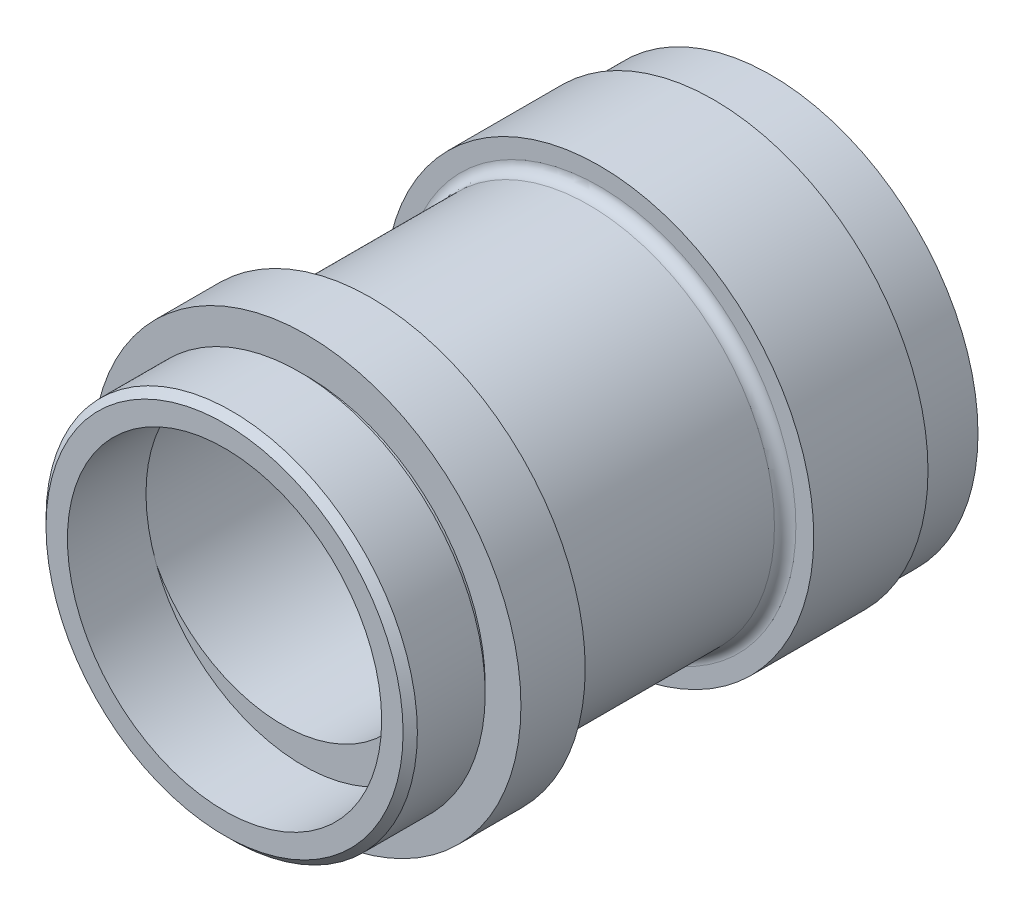
ISO-10303-21;
HEADER;
FILE_DESCRIPTION(('STEP AP214'),'2;1');
FILE_NAME('part.step','',(''),(''),'','','');
FILE_SCHEMA(('AUTOMOTIVE_DESIGN { 1 0 10303 214 1 1 1 1 }'));
ENDSEC;
DATA;
#1=APPLICATION_CONTEXT('core data for automotive mechanical design processes');
#2=APPLICATION_PROTOCOL_DEFINITION('international standard','automotive_design',2000,#1);
#3=PRODUCT_CONTEXT('',#1,'mechanical');
#4=PRODUCT('Part','Part','',(#3));
#5=PRODUCT_RELATED_PRODUCT_CATEGORY('part','',(#4));
#6=PRODUCT_DEFINITION_FORMATION('','',#4);
#7=PRODUCT_DEFINITION_CONTEXT('part definition',#1,'design');
#8=PRODUCT_DEFINITION('design','',#6,#7);
#9=PRODUCT_DEFINITION_SHAPE('','',#8);
#10=(LENGTH_UNIT() NAMED_UNIT(*) SI_UNIT(.MILLI.,.METRE.));
#11=(NAMED_UNIT(*) PLANE_ANGLE_UNIT() SI_UNIT($,.RADIAN.));
#12=(NAMED_UNIT(*) SI_UNIT($,.STERADIAN.) SOLID_ANGLE_UNIT());
#13=UNCERTAINTY_MEASURE_WITH_UNIT(LENGTH_MEASURE(1.E-05),#10,'distance_accuracy_value','');
#14=(GEOMETRIC_REPRESENTATION_CONTEXT(3) GLOBAL_UNCERTAINTY_ASSIGNED_CONTEXT((#13)) GLOBAL_UNIT_ASSIGNED_CONTEXT((#10,
#11,#12)) REPRESENTATION_CONTEXT('',''));
#15=CARTESIAN_POINT('',(0.,0.,0.));
#16=DIRECTION('',(0.,0.,1.));
#17=DIRECTION('',(1.,0.,0.));
#18=AXIS2_PLACEMENT_3D('',#15,#16,#17);
#19=CARTESIAN_POINT('',(0.,0.,4.));
#20=DIRECTION('',(0.,0.,-1.));
#21=DIRECTION('',(-1.,0.,0.));
#22=AXIS2_PLACEMENT_3D('',#19,#20,#21);
#23=CYLINDRICAL_SURFACE('',#22,14.5);
#24=CARTESIAN_POINT('',(0.,0.,4.));
#25=DIRECTION('',(0.,0.,1.));
#26=DIRECTION('',(1.,0.,0.));
#27=AXIS2_PLACEMENT_3D('',#24,#25,#26);
#28=CIRCLE('',#27,14.5);
#29=CARTESIAN_POINT('',(14.5,0.,4.));
#30=VERTEX_POINT('',#29);
#31=EDGE_CURVE('E107',#30,#30,#28,.T.);
#32=ORIENTED_EDGE('',*,*,#31,.F.);
#33=EDGE_LOOP('',(#32));
#34=FACE_BOUND('',#33,.T.);
#35=CARTESIAN_POINT('',(0.,0.,0.));
#36=DIRECTION('',(0.,0.,1.));
#37=DIRECTION('',(1.,0.,0.));
#38=AXIS2_PLACEMENT_3D('',#35,#36,#37);
#39=CIRCLE('',#38,14.5);
#40=CARTESIAN_POINT('',(14.5,0.,0.));
#41=VERTEX_POINT('',#40);
#42=EDGE_CURVE('E117',#41,#41,#39,.T.);
#43=ORIENTED_EDGE('',*,*,#42,.T.);
#44=EDGE_LOOP('',(#43));
#45=FACE_BOUND('',#44,.T.);
#46=ADVANCED_FACE('F49',(#34,#45),#23,.T.);
#47=CARTESIAN_POINT('',(0.,0.,0.));
#48=DIRECTION('',(0.,0.,1.));
#49=DIRECTION('',(1.,0.,0.));
#50=AXIS2_PLACEMENT_3D('',#47,#48,#49);
#51=PLANE('',#50);
#52=CARTESIAN_POINT('',(-1.44,0.75,0.));
#53=DIRECTION('',(0.,0.,1.));
#54=DIRECTION('',(1.,0.,0.));
#55=AXIS2_PLACEMENT_3D('',#52,#53,#54);
#56=CIRCLE('',#55,10.);
#57=CARTESIAN_POINT('',(8.56,0.75,0.));
#58=VERTEX_POINT('',#57);
#59=EDGE_CURVE('E84',#58,#58,#56,.T.);
#60=ORIENTED_EDGE('',*,*,#59,.T.);
#61=EDGE_LOOP('',(#60));
#62=FACE_BOUND('',#61,.T.);
#63=ORIENTED_EDGE('',*,*,#42,.F.);
#64=EDGE_LOOP('',(#63));
#65=FACE_BOUND('',#64,.T.);
#66=ADVANCED_FACE('F155',(#62,#65),#51,.F.);
#67=CARTESIAN_POINT('',(0.,0.,12.));
#68=DIRECTION('',(0.,0.,-1.));
#69=DIRECTION('',(-1.,0.,0.));
#70=AXIS2_PLACEMENT_3D('',#67,#68,#69);
#71=CYLINDRICAL_SURFACE('',#70,15.);
#72=CARTESIAN_POINT('',(0.,0.,12.));
#73=DIRECTION('',(0.,0.,1.));
#74=DIRECTION('',(1.,0.,0.));
#75=AXIS2_PLACEMENT_3D('',#72,#73,#74);
#76=CIRCLE('',#75,15.);
#77=CARTESIAN_POINT('',(15.,0.,12.));
#78=VERTEX_POINT('',#77);
#79=EDGE_CURVE('E114',#78,#78,#76,.T.);
#80=ORIENTED_EDGE('',*,*,#79,.F.);
#81=EDGE_LOOP('',(#80));
#82=FACE_BOUND('',#81,.T.);
#83=CARTESIAN_POINT('',(0.,0.,4.));
#84=DIRECTION('',(0.,0.,1.));
#85=DIRECTION('',(1.,0.,0.));
#86=AXIS2_PLACEMENT_3D('',#83,#84,#85);
#87=CIRCLE('',#86,15.);
#88=CARTESIAN_POINT('',(15.,0.,4.));
#89=VERTEX_POINT('',#88);
#90=EDGE_CURVE('E111',#89,#89,#87,.T.);
#91=ORIENTED_EDGE('',*,*,#90,.T.);
#92=EDGE_LOOP('',(#91));
#93=FACE_BOUND('',#92,.T.);
#94=ADVANCED_FACE('F162',(#82,#93),#71,.T.);
#95=CARTESIAN_POINT('',(0.,0.,12.));
#96=DIRECTION('',(0.,0.,1.));
#97=DIRECTION('',(1.,0.,0.));
#98=AXIS2_PLACEMENT_3D('',#95,#96,#97);
#99=PLANE('',#98);
#100=CARTESIAN_POINT('',(0.,0.,12.));
#101=DIRECTION('',(0.,0.,1.));
#102=DIRECTION('',(1.,0.,0.));
#103=AXIS2_PLACEMENT_3D('',#100,#101,#102);
#104=CIRCLE('',#103,13.75);
#105=CARTESIAN_POINT('',(13.75,0.,12.));
#106=VERTEX_POINT('',#105);
#107=EDGE_CURVE('E129',#106,#106,#104,.F.);
#108=ORIENTED_EDGE('',*,*,#107,.T.);
#109=EDGE_LOOP('',(#108));
#110=FACE_BOUND('',#109,.T.);
#111=ORIENTED_EDGE('',*,*,#79,.T.);
#112=EDGE_LOOP('',(#111));
#113=FACE_BOUND('',#112,.T.);
#114=ADVANCED_FACE('F210',(#110,#113),#99,.T.);
#115=CARTESIAN_POINT('',(0.,0.,4.));
#116=DIRECTION('',(0.,0.,1.));
#117=DIRECTION('',(1.,0.,0.));
#118=AXIS2_PLACEMENT_3D('',#115,#116,#117);
#119=PLANE('',#118);
#120=ORIENTED_EDGE('',*,*,#31,.T.);
#121=EDGE_LOOP('',(#120));
#122=FACE_BOUND('',#121,.T.);
#123=ORIENTED_EDGE('',*,*,#90,.F.);
#124=EDGE_LOOP('',(#123));
#125=FACE_BOUND('',#124,.T.);
#126=ADVANCED_FACE('F184',(#122,#125),#119,.F.);
#127=CARTESIAN_POINT('',(0.,0.,28.));
#128=DIRECTION('',(0.,0.,-1.));
#129=DIRECTION('',(-1.,0.,0.));
#130=AXIS2_PLACEMENT_3D('',#127,#128,#129);
#131=CYLINDRICAL_SURFACE('',#130,13.);
#132=CARTESIAN_POINT('',(0.,-13.,21.));
#133=CARTESIAN_POINT('',(0.0560814907698494,-12.9999994935529,20.9999975440825));
#134=CARTESIAN_POINT('',(0.1122015283261,-12.9996332271085,20.9952664359755));
#135=CARTESIAN_POINT('',(0.222889932281067,-12.9982073319335,20.9764621773833));
#136=CARTESIAN_POINT('',(0.277456450000707,-12.997146910426,20.9623783451217));
#137=CARTESIAN_POINT('',(0.383418608244872,-12.994452581674,20.9252773861471));
#138=CARTESIAN_POINT('',(0.434815983790358,-12.9928189915613,20.9022651987113));
#139=CARTESIAN_POINT('',(0.533005853178245,-12.9891617044986,20.847969326083));
#140=CARTESIAN_POINT('',(0.579799352410921,-12.9871380930081,20.816687452343));
#141=CARTESIAN_POINT('',(0.667568517957903,-12.9829230046582,20.7466658049635));
#142=CARTESIAN_POINT('',(0.708532705181918,-12.9807312093192,20.7079116606977));
#143=CARTESIAN_POINT('',(0.783382016525553,-12.9764294687494,20.6240757503406));
#144=CARTESIAN_POINT('',(0.817266834917226,-12.9743195270567,20.5789937111149));
#145=CARTESIAN_POINT('',(0.877033518122061,-12.9704168624999,20.4837133596551));
#146=CARTESIAN_POINT('',(0.902905435846584,-12.968624535088,20.4335087903064));
#147=CARTESIAN_POINT('',(0.945848345562935,-12.9655635081004,20.3294521888579));
#148=CARTESIAN_POINT('',(0.962919472356618,-12.9642948005044,20.2756002126396));
#149=CARTESIAN_POINT('',(0.987743279956157,-12.9624272217792,20.1658913947305));
#150=CARTESIAN_POINT('',(0.995514486774697,-12.9618270191131,20.1100387679558));
#151=CARTESIAN_POINT('',(1.00157507733568,-12.9613601552789,19.9978188832529));
#152=CARTESIAN_POINT('',(0.999864615135287,-12.9614934821925,19.9414516337011));
#153=CARTESIAN_POINT('',(0.987025750384139,-12.9624774073116,19.8299292739437));
#154=CARTESIAN_POINT('',(0.975917451791141,-12.9633264743837,19.7747718339038));
#155=CARTESIAN_POINT('',(0.944629454899662,-12.9656438018103,19.6671066925785));
#156=CARTESIAN_POINT('',(0.924449679526441,-12.9671120674258,19.6145990138107));
#157=CARTESIAN_POINT('',(0.875568942970116,-12.97050410972,19.5136596470741));
#158=CARTESIAN_POINT('',(0.846858928239396,-12.972428369926,19.4652323602694));
#159=CARTESIAN_POINT('',(0.781739221271187,-12.9765151166631,19.3738765736031));
#160=CARTESIAN_POINT('',(0.745329396516579,-12.978677607294,19.3309481684001));
#161=CARTESIAN_POINT('',(0.66573069422597,-12.9830039524831,19.25169180633));
#162=CARTESIAN_POINT('',(0.622524430401358,-12.9851677959587,19.2153813079507));
#163=CARTESIAN_POINT('',(0.53062007147499,-12.9892476500003,19.1505263575124));
#164=CARTESIAN_POINT('',(0.481921973376206,-12.991163660431,19.1219819096916));
#165=CARTESIAN_POINT('',(0.38040521301149,-12.9945322475704,19.0734705504451));
#166=CARTESIAN_POINT('',(0.327586197932004,-12.9959847845445,19.0535043744051));
#167=CARTESIAN_POINT('',(0.219331986593499,-12.9982622809101,19.0227283581117));
#168=CARTESIAN_POINT('',(0.163896836613429,-12.9990872513988,19.0119183559514));
#169=CARTESIAN_POINT('',(0.0521353319359007,-13.0000152355339,18.9997833458647));
#170=CARTESIAN_POINT('',(-0.00418838895979883,-13.0001200852723,18.9984342153689));
#171=CARTESIAN_POINT('',(-0.116261248401295,-12.9996009110167,19.0051961082285));
#172=CARTESIAN_POINT('',(-0.172010391499682,-12.9989768928024,19.01330705657));
#173=CARTESIAN_POINT('',(-0.281283080875072,-12.9970713651132,19.0387388802441));
#174=CARTESIAN_POINT('',(-0.334809235536229,-12.9957906511816,19.0560486127818));
#175=CARTESIAN_POINT('',(-0.438197238207755,-12.9927156735826,19.0993752864426));
#176=CARTESIAN_POINT('',(-0.488059036618082,-12.9909214029654,19.1253923454001));
#177=CARTESIAN_POINT('',(-0.58281294533008,-12.987016029033,19.1854560299777));
#178=CARTESIAN_POINT('',(-0.627694871276057,-12.9849042965023,19.2195186804667));
#179=CARTESIAN_POINT('',(-0.711112292590118,-12.9806035048102,19.2946834268227));
#180=CARTESIAN_POINT('',(-0.749647693943566,-12.9784144445039,19.3357856269521));
#181=CARTESIAN_POINT('',(-0.819360586100637,-12.974200318524,19.4239672078289));
#182=CARTESIAN_POINT('',(-0.850522366332239,-12.9721756089433,19.471059028099));
#183=CARTESIAN_POINT('',(-0.90449581532578,-12.9685242888167,19.5698209679124));
#184=CARTESIAN_POINT('',(-0.927307556813046,-12.9668976748036,19.6214910475761));
#185=CARTESIAN_POINT('',(-0.963906473397053,-12.9642285924288,19.7278865613879));
#186=CARTESIAN_POINT('',(-0.97770335706171,-12.9631854958217,19.7826086394922));
#187=CARTESIAN_POINT('',(-0.995912558294159,-12.9617993686693,19.8936009674173));
#188=CARTESIAN_POINT('',(-1.00032502648953,-12.9614563268874,19.9498711923743));
#189=CARTESIAN_POINT('',(-0.999638511579495,-12.9615092798327,20.0622063640792));
#190=CARTESIAN_POINT('',(-0.994564216946177,-12.9619033562753,20.1182714642693));
#191=CARTESIAN_POINT('',(-0.975099599309303,-12.9633820704167,20.2287507986101));
#192=CARTESIAN_POINT('',(-0.960709261076539,-12.9644667092444,20.283165030062));
#193=CARTESIAN_POINT('',(-0.923027087120174,-12.967203837997,20.3888002744591));
#194=CARTESIAN_POINT('',(-0.899735591367294,-12.968856306234,20.4400214092745));
#195=CARTESIAN_POINT('',(-0.844915171953842,-12.9725429181572,20.5378301715099));
#196=CARTESIAN_POINT('',(-0.813386405861939,-12.9745770545423,20.584417887538));
#197=CARTESIAN_POINT('',(-0.742893897823809,-12.9788040663569,20.6717634832005));
#198=CARTESIAN_POINT('',(-0.703911966411881,-12.9809973218178,20.7125066644019));
#199=CARTESIAN_POINT('',(-0.619650805552196,-12.9852920085213,20.786887075957));
#200=CARTESIAN_POINT('',(-0.574370049103566,-12.9873934173351,20.8205225782265));
#201=CARTESIAN_POINT('',(-0.478721573484144,-12.9912708677167,20.8797709397441));
#202=CARTESIAN_POINT('',(-0.428345598441361,-12.9930463676726,20.9053704936795));
#203=CARTESIAN_POINT('',(-0.32403189541908,-12.9960653549984,20.9477156130273));
#204=CARTESIAN_POINT('',(-0.270098369537907,-12.9973094574984,20.9644714210244));
#205=CARTESIAN_POINT('',(-0.179868830247522,-12.9988038385362,20.9843563268074));
#206=CARTESIAN_POINT('',(-0.144154148453302,-12.9992503735318,20.9902149789881));
#207=CARTESIAN_POINT('',(-0.0722983180735108,-12.9998486171984,20.9980376029879));
#208=CARTESIAN_POINT('',(-0.0361571704282497,-13.0000003265194,21.0000015833927));
#209=CARTESIAN_POINT('',(0.,-13.,21.));
#210=B_SPLINE_CURVE_WITH_KNOTS('',3,(#132,#133,#134,#135,#136,#137,#138,#139,#140,#141,#142,
#143,#144,#145,#146,#147,#148,#149,#150,#151,#152,#153,#154,#155,#156,#157,#158,#159,#160,#161,
#162,#163,#164,#165,#166,#167,#168,#169,#170,#171,#172,#173,#174,#175,#176,#177,#178,#179,#180,
#181,#182,#183,#184,#185,#186,#187,#188,#189,#190,#191,#192,#193,#194,#195,#196,#197,#198,#199,
#200,#201,#202,#203,#204,#205,#206,#207,#208,#209),.UNSPECIFIED.,.T.,.F.,(4,2,2,2,2,2,2,2,2,2,2,
2,2,2,2,2,2,2,2,2,2,2,2,2,2,2,2,2,2,2,2,2,2,2,2,2,2,2,4),(0.,0.168112465315284,
0.336417263394324,0.504629085620895,0.672804091988169,0.84130581709007,1.00981481756411,
1.1785321716854,1.34724694148352,1.51562505862667,1.68400043998792,1.85201653894623,
2.02003406546065,2.18823055785303,2.35642994521668,2.52506682664287,2.6937038000987,
2.86235522733701,3.03100367227984,3.19922195412495,3.36743890208858,3.53545254615542,
3.70346846400479,3.87182189353083,4.04017781674655,4.20888928027387,4.37759927436029,
4.54612727511614,4.71465257083871,4.88273990456443,5.05082751306812,5.21890870227688,
5.38698667653829,5.55548020584199,5.72401465382744,5.89282669420567,6.06144278967866,
6.16982943161637,6.27821583461809),.UNSPECIFIED.);
#211=CARTESIAN_POINT('',(0.,-13.,21.));
#212=VERTEX_POINT('',#211);
#213=EDGE_CURVE('E78',#212,#212,#210,.T.);
#214=ORIENTED_EDGE('',*,*,#213,.T.);
#215=EDGE_LOOP('',(#214));
#216=FACE_BOUND('',#215,.T.);
#217=CARTESIAN_POINT('',(0.,0.,12.75));
#218=DIRECTION('',(0.,0.,1.));
#219=DIRECTION('',(1.,0.,0.));
#220=AXIS2_PLACEMENT_3D('',#217,#218,#219);
#221=CIRCLE('',#220,13.);
#222=CARTESIAN_POINT('',(13.,0.,12.75));
#223=VERTEX_POINT('',#222);
#224=EDGE_CURVE('E126',#223,#223,#221,.T.);
#225=ORIENTED_EDGE('',*,*,#224,.T.);
#226=EDGE_LOOP('',(#225));
#227=FACE_BOUND('',#226,.T.);
#228=CARTESIAN_POINT('',(0.,0.,27.25));
#229=DIRECTION('',(0.,0.,1.));
#230=DIRECTION('',(1.,0.,0.));
#231=AXIS2_PLACEMENT_3D('',#228,#229,#230);
#232=CIRCLE('',#231,13.);
#233=CARTESIAN_POINT('',(13.,0.,27.25));
#234=VERTEX_POINT('',#233);
#235=EDGE_CURVE('E106',#234,#234,#232,.F.);
#236=ORIENTED_EDGE('',*,*,#235,.T.);
#237=EDGE_LOOP('',(#236));
#238=FACE_BOUND('',#237,.T.);
#239=ADVANCED_FACE('F180',(#216,#227,#238),#131,.T.);
#240=CARTESIAN_POINT('',(0.,0.,32.5));
#241=DIRECTION('',(0.,0.,-1.));
#242=DIRECTION('',(-1.,0.,0.));
#243=AXIS2_PLACEMENT_3D('',#240,#241,#242);
#244=CYLINDRICAL_SURFACE('',#243,15.);
#245=CARTESIAN_POINT('',(0.,0.,32.5));
#246=DIRECTION('',(0.,0.,1.));
#247=DIRECTION('',(1.,0.,0.));
#248=AXIS2_PLACEMENT_3D('',#245,#246,#247);
#249=CIRCLE('',#248,15.);
#250=CARTESIAN_POINT('',(15.,0.,32.5));
#251=VERTEX_POINT('',#250);
#252=EDGE_CURVE('E108',#251,#251,#249,.T.);
#253=ORIENTED_EDGE('',*,*,#252,.F.);
#254=EDGE_LOOP('',(#253));
#255=FACE_BOUND('',#254,.T.);
#256=CARTESIAN_POINT('',(0.,0.,28.));
#257=DIRECTION('',(0.,0.,1.));
#258=DIRECTION('',(1.,0.,0.));
#259=AXIS2_PLACEMENT_3D('',#256,#257,#258);
#260=CIRCLE('',#259,15.);
#261=CARTESIAN_POINT('',(15.,0.,28.));
#262=VERTEX_POINT('',#261);
#263=EDGE_CURVE('E102',#262,#262,#260,.T.);
#264=ORIENTED_EDGE('',*,*,#263,.T.);
#265=EDGE_LOOP('',(#264));
#266=FACE_BOUND('',#265,.T.);
#267=ADVANCED_FACE('F183',(#255,#266),#244,.T.);
#268=CARTESIAN_POINT('',(0.,0.,32.5));
#269=DIRECTION('',(0.,0.,1.));
#270=DIRECTION('',(1.,0.,0.));
#271=AXIS2_PLACEMENT_3D('',#268,#269,#270);
#272=PLANE('',#271);
#273=CARTESIAN_POINT('',(0.,0.,32.5));
#274=DIRECTION('',(0.,0.,1.));
#275=DIRECTION('',(1.,0.,0.));
#276=AXIS2_PLACEMENT_3D('',#273,#274,#275);
#277=CIRCLE('',#276,12.5);
#278=CARTESIAN_POINT('',(12.5,0.,32.5));
#279=VERTEX_POINT('',#278);
#280=EDGE_CURVE('E103',#279,#279,#277,.T.);
#281=ORIENTED_EDGE('',*,*,#280,.F.);
#282=EDGE_LOOP('',(#281));
#283=FACE_BOUND('',#282,.T.);
#284=ORIENTED_EDGE('',*,*,#252,.T.);
#285=EDGE_LOOP('',(#284));
#286=FACE_BOUND('',#285,.T.);
#287=ADVANCED_FACE('F194',(#283,#286),#272,.T.);
#288=CARTESIAN_POINT('',(0.,0.,28.));
#289=DIRECTION('',(0.,0.,1.));
#290=DIRECTION('',(1.,0.,0.));
#291=AXIS2_PLACEMENT_3D('',#288,#289,#290);
#292=PLANE('',#291);
#293=CARTESIAN_POINT('',(0.,0.,28.));
#294=DIRECTION('',(0.,0.,1.));
#295=DIRECTION('',(1.,0.,0.));
#296=AXIS2_PLACEMENT_3D('',#293,#294,#295);
#297=CIRCLE('',#296,13.75);
#298=CARTESIAN_POINT('',(13.75,0.,28.));
#299=VERTEX_POINT('',#298);
#300=EDGE_CURVE('E132',#299,#299,#297,.T.);
#301=ORIENTED_EDGE('',*,*,#300,.T.);
#302=EDGE_LOOP('',(#301));
#303=FACE_BOUND('',#302,.T.);
#304=ORIENTED_EDGE('',*,*,#263,.F.);
#305=EDGE_LOOP('',(#304));
#306=FACE_BOUND('',#305,.T.);
#307=ADVANCED_FACE('F191',(#303,#306),#292,.F.);
#308=CARTESIAN_POINT('',(0.,0.,33.));
#309=DIRECTION('',(0.,0.,-1.));
#310=DIRECTION('',(-1.,0.,0.));
#311=AXIS2_PLACEMENT_3D('',#308,#309,#310);
#312=CYLINDRICAL_SURFACE('',#311,12.5);
#313=CARTESIAN_POINT('',(0.,0.,33.));
#314=DIRECTION('',(0.,0.,1.));
#315=DIRECTION('',(1.,0.,0.));
#316=AXIS2_PLACEMENT_3D('',#313,#314,#315);
#317=CIRCLE('',#316,12.5);
#318=CARTESIAN_POINT('',(12.5,0.,33.));
#319=VERTEX_POINT('',#318);
#320=EDGE_CURVE('E94',#319,#319,#317,.T.);
#321=ORIENTED_EDGE('',*,*,#320,.F.);
#322=EDGE_LOOP('',(#321));
#323=FACE_BOUND('',#322,.T.);
#324=ORIENTED_EDGE('',*,*,#280,.T.);
#325=EDGE_LOOP('',(#324));
#326=FACE_BOUND('',#325,.T.);
#327=ADVANCED_FACE('F193',(#323,#326),#312,.T.);
#328=CARTESIAN_POINT('',(0.,0.,38.25));
#329=DIRECTION('',(0.,0.,-1.));
#330=DIRECTION('',(-1.,0.,0.));
#331=AXIS2_PLACEMENT_3D('',#328,#329,#330);
#332=CYLINDRICAL_SURFACE('',#331,13.);
#333=CARTESIAN_POINT('',(0.,0.,37.75));
#334=DIRECTION('',(0.,0.,1.));
#335=DIRECTION('',(1.,0.,0.));
#336=AXIS2_PLACEMENT_3D('',#333,#334,#335);
#337=CIRCLE('',#336,13.);
#338=CARTESIAN_POINT('',(-13.,0.,37.75));
#339=VERTEX_POINT('',#338);
#340=EDGE_CURVE('E11',#339,#339,#337,.F.);
#341=CARTESIAN_POINT('',(0.,0.,33.));
#342=DIRECTION('',(0.,0.,1.));
#343=DIRECTION('',(1.,0.,0.));
#344=AXIS2_PLACEMENT_3D('',#341,#342,#343);
#345=CIRCLE('',#344,13.);
#346=CARTESIAN_POINT('',(-13.,0.,33.));
#347=VERTEX_POINT('',#346);
#348=EDGE_CURVE('E92',#347,#347,#345,.T.);
#349=CARTESIAN_POINT('',(-13.,0.,37.75));
#350=CARTESIAN_POINT('',(-13.,0.,37.7005208333334));
#351=CARTESIAN_POINT('',(-13.,0.,37.6510416666667));
#352=CARTESIAN_POINT('',(-13.,0.,37.5520833333334));
#353=CARTESIAN_POINT('',(-13.,0.,37.5026041666667));
#354=CARTESIAN_POINT('',(-13.,0.,37.4036458333334));
#355=CARTESIAN_POINT('',(-13.,0.,37.3541666666667));
#356=CARTESIAN_POINT('',(-13.,0.,37.2552083333334));
#357=CARTESIAN_POINT('',(-13.,0.,37.2057291666667));
#358=CARTESIAN_POINT('',(-13.,0.,37.1067708333334));
#359=CARTESIAN_POINT('',(-13.,0.,37.0572916666667));
#360=CARTESIAN_POINT('',(-13.,0.,36.9583333333334));
#361=CARTESIAN_POINT('',(-13.,0.,36.9088541666667));
#362=CARTESIAN_POINT('',(-13.,0.,36.8098958333334));
#363=CARTESIAN_POINT('',(-13.,0.,36.7604166666667));
#364=CARTESIAN_POINT('',(-13.,0.,36.6614583333334));
#365=CARTESIAN_POINT('',(-13.,0.,36.6119791666667));
#366=CARTESIAN_POINT('',(-13.,0.,36.5130208333334));
#367=CARTESIAN_POINT('',(-13.,0.,36.4635416666667));
#368=CARTESIAN_POINT('',(-13.,0.,36.3645833333333));
#369=CARTESIAN_POINT('',(-13.,0.,36.3151041666667));
#370=CARTESIAN_POINT('',(-13.,0.,36.2161458333333));
#371=CARTESIAN_POINT('',(-13.,0.,36.1666666666667));
#372=CARTESIAN_POINT('',(-13.,0.,36.0677083333333));
#373=CARTESIAN_POINT('',(-13.,0.,36.0182291666667));
#374=CARTESIAN_POINT('',(-13.,0.,35.9192708333333));
#375=CARTESIAN_POINT('',(-13.,0.,35.8697916666667));
#376=CARTESIAN_POINT('',(-13.,0.,35.7708333333333));
#377=CARTESIAN_POINT('',(-13.,0.,35.7213541666667));
#378=CARTESIAN_POINT('',(-13.,0.,35.6223958333333));
#379=CARTESIAN_POINT('',(-13.,0.,35.5729166666667));
#380=CARTESIAN_POINT('',(-13.,0.,35.4739583333333));
#381=CARTESIAN_POINT('',(-13.,0.,35.4244791666667));
#382=CARTESIAN_POINT('',(-13.,0.,35.3255208333333));
#383=CARTESIAN_POINT('',(-13.,0.,35.2760416666667));
#384=CARTESIAN_POINT('',(-13.,0.,35.1770833333333));
#385=CARTESIAN_POINT('',(-13.,0.,35.1276041666667));
#386=CARTESIAN_POINT('',(-13.,0.,35.0286458333333));
#387=CARTESIAN_POINT('',(-13.,0.,34.9791666666667));
#388=CARTESIAN_POINT('',(-13.,0.,34.8802083333333));
#389=CARTESIAN_POINT('',(-13.,0.,34.8307291666667));
#390=CARTESIAN_POINT('',(-13.,0.,34.7317708333333));
#391=CARTESIAN_POINT('',(-13.,0.,34.6822916666667));
#392=CARTESIAN_POINT('',(-13.,0.,34.5833333333333));
#393=CARTESIAN_POINT('',(-13.,0.,34.5338541666667));
#394=CARTESIAN_POINT('',(-13.,0.,34.4348958333333));
#395=CARTESIAN_POINT('',(-13.,0.,34.3854166666667));
#396=CARTESIAN_POINT('',(-13.,0.,34.2864583333333));
#397=CARTESIAN_POINT('',(-13.,0.,34.2369791666667));
#398=CARTESIAN_POINT('',(-13.,0.,34.1380208333333));
#399=CARTESIAN_POINT('',(-13.,0.,34.0885416666667));
#400=CARTESIAN_POINT('',(-13.,0.,33.9895833333333));
#401=CARTESIAN_POINT('',(-13.,0.,33.9401041666667));
#402=CARTESIAN_POINT('',(-13.,0.,33.8411458333333));
#403=CARTESIAN_POINT('',(-13.,0.,33.7916666666667));
#404=CARTESIAN_POINT('',(-13.,0.,33.6927083333333));
#405=CARTESIAN_POINT('',(-13.,0.,33.6432291666667));
#406=CARTESIAN_POINT('',(-13.,0.,33.5442708333333));
#407=CARTESIAN_POINT('',(-13.,0.,33.4947916666667));
#408=CARTESIAN_POINT('',(-13.,0.,33.3958333333333));
#409=CARTESIAN_POINT('',(-13.,0.,33.3463541666667));
#410=CARTESIAN_POINT('',(-13.,0.,33.2473958333333));
#411=CARTESIAN_POINT('',(-13.,0.,33.1979166666667));
#412=CARTESIAN_POINT('',(-13.,0.,33.0989583333333));
#413=CARTESIAN_POINT('',(-13.,0.,33.0494791666667));
#414=CARTESIAN_POINT('',(-13.,0.,33.));
#415=B_SPLINE_CURVE_WITH_KNOTS('',3,(#349,#350,#351,#352,#353,#354,#355,#356,#357,#358,#359,
#360,#361,#362,#363,#364,#365,#366,#367,#368,#369,#370,#371,#372,#373,#374,#375,#376,#377,#378,
#379,#380,#381,#382,#383,#384,#385,#386,#387,#388,#389,#390,#391,#392,#393,#394,#395,#396,#397,
#398,#399,#400,#401,#402,#403,#404,#405,#406,#407,#408,#409,#410,#411,#412,#413,#414),
.UNSPECIFIED.,.F.,.F.,(4,2,2,2,2,2,2,2,2,2,2,2,2,2,2,2,2,2,2,2,2,2,2,2,2,2,2,2,2,2,2,2,4),(0.,
0.148437500000001,0.296875000000002,0.445312500000003,0.593750000000004,0.742187500000005,
0.890625000000006,1.03906250000001,1.18750000000001,1.33593750000001,1.48437500000001,
1.63281250000001,1.78125000000001,1.92968750000001,2.07812500000001,2.22656250000002,
2.37500000000002,2.52343750000002,2.67187500000002,2.82031250000002,2.96875000000002,
3.11718750000002,3.26562500000002,3.41406250000002,3.56250000000002,3.71093750000002,
3.85937500000003,4.00781250000003,4.15625000000003,4.30468750000003,4.45312500000003,
4.60156250000003,4.75000000000003),.UNSPECIFIED.);
#416=EDGE_CURVE('BSEAM229',#339,#347,#415,.T.);
#417=ORIENTED_EDGE('',*,*,#340,.T.);
#418=ORIENTED_EDGE('',*,*,#348,.T.);
#419=ORIENTED_EDGE('',*,*,#416,.T.);
#420=ORIENTED_EDGE('',*,*,#416,.F.);
#421=EDGE_LOOP('',(#417,#419,#418,#420));
#422=FACE_BOUND('',#421,.T.);
#423=ADVANCED_FACE('F229',(#422),#332,.T.);
#424=CARTESIAN_POINT('',(0.,0.,38.25));
#425=DIRECTION('',(0.,0.,1.));
#426=DIRECTION('',(1.,0.,0.));
#427=AXIS2_PLACEMENT_3D('',#424,#425,#426);
#428=PLANE('',#427);
#429=CARTESIAN_POINT('',(0.,0.,38.25));
#430=DIRECTION('',(0.,0.,1.));
#431=DIRECTION('',(1.,0.,0.));
#432=AXIS2_PLACEMENT_3D('',#429,#430,#431);
#433=CIRCLE('',#432,12.5);
#434=CARTESIAN_POINT('',(12.5,0.,38.25));
#435=VERTEX_POINT('',#434);
#436=EDGE_CURVE('E64',#435,#435,#433,.T.);
#437=ORIENTED_EDGE('',*,*,#436,.T.);
#438=EDGE_LOOP('',(#437));
#439=FACE_BOUND('',#438,.T.);
#440=CARTESIAN_POINT('',(0.,0.,38.25));
#441=DIRECTION('',(0.,0.,1.));
#442=DIRECTION('',(1.,0.,0.));
#443=AXIS2_PLACEMENT_3D('',#440,#441,#442);
#444=CIRCLE('',#443,11.);
#445=CARTESIAN_POINT('',(11.,0.,38.25));
#446=VERTEX_POINT('',#445);
#447=EDGE_CURVE('E88',#446,#446,#444,.T.);
#448=ORIENTED_EDGE('',*,*,#447,.F.);
#449=EDGE_LOOP('',(#448));
#450=FACE_BOUND('',#449,.T.);
#451=ADVANCED_FACE('F138',(#439,#450),#428,.T.);
#452=CARTESIAN_POINT('',(0.,0.,33.));
#453=DIRECTION('',(0.,0.,1.));
#454=DIRECTION('',(1.,0.,0.));
#455=AXIS2_PLACEMENT_3D('',#452,#453,#454);
#456=PLANE('',#455);
#457=ORIENTED_EDGE('',*,*,#320,.T.);
#458=EDGE_LOOP('',(#457));
#459=FACE_BOUND('',#458,.T.);
#460=ORIENTED_EDGE('',*,*,#348,.F.);
#461=EDGE_LOOP('',(#460));
#462=FACE_BOUND('',#461,.T.);
#463=ADVANCED_FACE('F227',(#459,#462),#456,.F.);
#464=CARTESIAN_POINT('',(0.,0.,32.75));
#465=DIRECTION('',(0.,0.,1.));
#466=DIRECTION('',(1.,0.,0.));
#467=AXIS2_PLACEMENT_3D('',#464,#465,#466);
#468=CYLINDRICAL_SURFACE('',#467,11.);
#469=CARTESIAN_POINT('',(0.,0.,32.75));
#470=DIRECTION('',(0.,0.,1.));
#471=DIRECTION('',(1.,0.,0.));
#472=AXIS2_PLACEMENT_3D('',#469,#470,#471);
#473=CIRCLE('',#472,11.);
#474=CARTESIAN_POINT('',(-2.64603790001168,10.6770072319776,32.75));
#475=VERTEX_POINT('',#474);
#476=CARTESIAN_POINT('',(-10.2654540767722,-3.95227182740265,32.75));
#477=VERTEX_POINT('',#476);
#478=EDGE_CURVE('E83',#475,#477,#473,.T.);
#479=ORIENTED_EDGE('',*,*,#478,.F.);
#480=EDGE_CURVE('E85',#477,#475,#473,.T.);
#481=ORIENTED_EDGE('',*,*,#480,.F.);
#482=EDGE_LOOP('',(#479,#481));
#483=FACE_BOUND('',#482,.T.);
#484=ORIENTED_EDGE('',*,*,#447,.T.);
#485=EDGE_LOOP('',(#484));
#486=FACE_BOUND('',#485,.T.);
#487=ADVANCED_FACE('F90',(#483,#486),#468,.F.);
#488=CARTESIAN_POINT('',(0.,0.,32.75));
#489=DIRECTION('',(0.,0.,1.));
#490=DIRECTION('',(1.,0.,0.));
#491=AXIS2_PLACEMENT_3D('',#488,#489,#490);
#492=PLANE('',#491);
#493=CARTESIAN_POINT('',(-1.44,0.75,32.75));
#494=DIRECTION('',(0.,0.,1.));
#495=DIRECTION('',(1.,0.,0.));
#496=AXIS2_PLACEMENT_3D('',#493,#494,#495);
#497=CIRCLE('',#496,10.);
#498=EDGE_CURVE('E73',#477,#475,#497,.T.);
#499=ORIENTED_EDGE('',*,*,#498,.F.);
#500=ORIENTED_EDGE('',*,*,#480,.T.);
#501=EDGE_LOOP('',(#499,#500));
#502=FACE_BOUND('',#501,.T.);
#503=ADVANCED_FACE('F86',(#502),#492,.T.);
#504=CARTESIAN_POINT('',(-1.44,0.75,0.));
#505=DIRECTION('',(0.,0.,1.));
#506=DIRECTION('',(1.,0.,0.));
#507=AXIS2_PLACEMENT_3D('',#504,#505,#506);
#508=CYLINDRICAL_SURFACE('',#507,10.);
#509=CARTESIAN_POINT('',(0.,-9.14577687703194,21.));
#510=CARTESIAN_POINT('',(-0.0559419526901481,-9.15391673927601,20.9999977485305));
#511=CARTESIAN_POINT('',(-0.111987348326511,-9.16158347892716,20.9952911814136));
#512=CARTESIAN_POINT('',(-0.222674268881258,-9.17578662225442,20.9765104336833));
#513=CARTESIAN_POINT('',(-0.277314434379255,-9.18232196402944,20.9624275120831));
#514=CARTESIAN_POINT('',(-0.383573347255901,-9.1941852986242,20.9252237639855));
#515=CARTESIAN_POINT('',(-0.435192045075695,-9.1995132716445,20.9021027892914));
#516=CARTESIAN_POINT('',(-0.533869394724749,-9.20898526084501,20.8474457027273));
#517=CARTESIAN_POINT('',(-0.580928984849961,-9.21312952098507,20.8159113274298));
#518=CARTESIAN_POINT('',(-0.66881667416927,-9.22031651367114,20.7455418173041));
#519=CARTESIAN_POINT('',(-0.709683496709779,-9.22336626963331,20.7067557537856));
#520=CARTESIAN_POINT('',(-0.784359182755638,-9.22855399659054,20.6228443635189));
#521=CARTESIAN_POINT('',(-0.818167924232952,-9.23069195182202,20.5777189271909));
#522=CARTESIAN_POINT('',(-0.877676456786587,-9.23422165828078,20.4825224844274));
#523=CARTESIAN_POINT('',(-0.903394413895672,-9.23561508616521,20.4324628935447));
#524=CARTESIAN_POINT('',(-0.946086875025937,-9.23781804862132,20.3287328512732));
#525=CARTESIAN_POINT('',(-0.963061368809334,-9.23862758250931,20.2750623956564));
#526=CARTESIAN_POINT('',(-0.987791174024957,-9.23977788453155,20.16558980052));
#527=CARTESIAN_POINT('',(-0.995539396658547,-9.24011829225478,20.1097860558658));
#528=CARTESIAN_POINT('',(-1.00157190669226,-9.24038489345322,19.9976683159787));
#529=CARTESIAN_POINT('',(-0.999856166824883,-9.240311085735,19.9413543192761));
#530=CARTESIAN_POINT('',(-0.987006019066591,-9.23973658297917,19.8297818452061));
#531=CARTESIAN_POINT('',(-0.975866404624034,-9.23923565196105,19.7745239685905));
#532=CARTESIAN_POINT('',(-0.944480043348482,-9.23772770747911,19.6666652228533));
#533=CARTESIAN_POINT('',(-0.924233295711824,-9.23672069397063,19.6140643539662));
#534=CARTESIAN_POINT('',(-0.875219701733015,-9.23406842856449,19.5130273403156));
#535=CARTESIAN_POINT('',(-0.846454916377715,-9.23242333102502,19.4645901917704));
#536=CARTESIAN_POINT('',(-0.781233836471733,-9.22833107715732,19.3732440180561));
#537=CARTESIAN_POINT('',(-0.74477763955544,-9.22588393101003,19.3303349227253));
#538=CARTESIAN_POINT('',(-0.66526836449,-9.22002380110445,19.2512962010526));
#539=CARTESIAN_POINT('',(-0.622221219414621,-9.21661168368193,19.2151605417964));
#540=CARTESIAN_POINT('',(-0.530761062680471,-9.20868404320909,19.1506326606482));
#541=CARTESIAN_POINT('',(-0.482348116807087,-9.20416853368568,19.1222403438367));
#542=CARTESIAN_POINT('',(-0.381541950572882,-9.19395451190337,19.0739597913764));
#543=CARTESIAN_POINT('',(-0.329146900466721,-9.18825545370398,19.054075493257));
#544=CARTESIAN_POINT('',(-0.221907994412823,-9.1756820889302,19.0233380970186));
#545=CARTESIAN_POINT('',(-0.167064077375912,-9.16880775302534,19.0124852243293));
#546=CARTESIAN_POINT('',(-0.0561308537538428,-9.15394147450674,19.0000077576263));
#547=CARTESIAN_POINT('',(-3.58750181054198E-05,-9.14594275832125,18.9984417824065));
#548=CARTESIAN_POINT('',(0.111498899040239,-9.12907049012237,19.0046666345568));
#549=CARTESIAN_POINT('',(0.166938642999835,-9.12019687002911,19.0124581906032));
#550=CARTESIAN_POINT('',(0.276367702033661,-9.10176133587792,19.0372905412163));
#551=CARTESIAN_POINT('',(0.330328735287324,-9.0921919646393,19.0544504371305));
#552=CARTESIAN_POINT('',(0.434567135824773,-9.07287183107857,19.0975954761915));
#553=CARTESIAN_POINT('',(0.484844178826487,-9.06312105288266,19.1235813951144));
#554=CARTESIAN_POINT('',(0.580849108411686,-9.04380386664564,19.1839948510151));
#555=CARTESIAN_POINT('',(0.626523649722609,-9.03424047202006,19.2185082108668));
#556=CARTESIAN_POINT('',(0.711414944261768,-9.01592561470457,19.294911714354));
#557=CARTESIAN_POINT('',(0.750631736640761,-9.00717414709241,19.3368018132642));
#558=CARTESIAN_POINT('',(0.82121941577117,-8.99105708854696,19.4265559264805));
#559=CARTESIAN_POINT('',(0.852636689713985,-8.98368337176506,19.4743819531218));
#560=CARTESIAN_POINT('',(0.906935895093516,-8.97073428166026,19.5748792187871));
#561=CARTESIAN_POINT('',(0.929819189840167,-8.96515862111571,19.6275496822311));
#562=CARTESIAN_POINT('',(0.965832910957298,-8.95630237197826,19.7348728366156));
#563=CARTESIAN_POINT('',(0.97918724564959,-8.95296920572406,19.7894460339735));
#564=CARTESIAN_POINT('',(0.996577505407373,-8.94861703593156,19.9001451245479));
#565=CARTESIAN_POINT('',(1.00061491111657,-8.94759766468604,19.9562707696149));
#566=CARTESIAN_POINT('',(0.999248973443599,-8.94794121721562,20.0670976042755));
#567=CARTESIAN_POINT('',(0.9940614309369,-8.94924968572434,20.1218017654883));
#568=CARTESIAN_POINT('',(0.974838205439448,-8.95405344346628,20.2295303023352));
#569=CARTESIAN_POINT('',(0.960802646742816,-8.95754870198017,20.282554701555));
#570=CARTESIAN_POINT('',(0.924342659982575,-8.96649284982915,20.385447673031));
#571=CARTESIAN_POINT('',(0.901919164188167,-8.97194152205116,20.4353165952796));
#572=CARTESIAN_POINT('',(0.849372226401018,-8.98444920334163,20.5305915087204));
#573=CARTESIAN_POINT('',(0.819248206043914,-8.99150833336269,20.5759971643345));
#574=CARTESIAN_POINT('',(0.751409877138409,-9.00699527780144,20.6621606039229));
#575=CARTESIAN_POINT('',(0.71354070445014,-9.01545020146051,20.702791539175));
#576=CARTESIAN_POINT('',(0.631703980495802,-9.03313817085488,20.7771803315953));
#577=CARTESIAN_POINT('',(0.587734255039907,-9.04237149354318,20.8109357277418));
#578=CARTESIAN_POINT('',(0.493711856663547,-9.06137677094389,20.8714662053518));
#579=CARTESIAN_POINT('',(0.443534050359935,-9.07115643118246,20.8980444725351));
#580=CARTESIAN_POINT('',(0.339419333292479,-9.09055184989177,20.9423315781472));
#581=CARTESIAN_POINT('',(0.285486250230701,-9.10016776317327,20.9600493015001));
#582=CARTESIAN_POINT('',(0.192762610063358,-9.11587821585596,20.9820101035879));
#583=CARTESIAN_POINT('',(0.154568785490826,-9.1221258114989,20.9887414947652));
#584=CARTESIAN_POINT('',(0.0775999152556314,-9.13425052572817,20.9977372225624));
#585=CARTESIAN_POINT('',(0.0388248700332806,-9.14012764459514,21.0000015625663));
#586=CARTESIAN_POINT('',(0.,-9.14577687703194,21.));
#587=B_SPLINE_CURVE_WITH_KNOTS('',3,(#509,#510,#511,#512,#513,#514,#515,#516,#517,#518,#519,
#520,#521,#522,#523,#524,#525,#526,#527,#528,#529,#530,#531,#532,#533,#534,#535,#536,#537,#538,
#539,#540,#541,#542,#543,#544,#545,#546,#547,#548,#549,#550,#551,#552,#553,#554,#555,#556,#557,
#558,#559,#560,#561,#562,#563,#564,#565,#566,#567,#568,#569,#570,#571,#572,#573,#574,#575,#576,
#577,#578,#579,#580,#581,#582,#583,#584,#585,#586),.UNSPECIFIED.,.T.,.F.,(4,2,2,2,2,2,2,2,2,2,2,
2,2,2,2,2,2,2,2,2,2,2,2,2,2,2,2,2,2,2,2,2,2,2,2,2,2,2,4),(0.,0.169452811399121,
0.339063814621307,0.508677599065658,0.678256401329199,0.846726695406469,1.01519990194635,
1.18329209463527,1.35138448414409,1.51960594051086,1.68782788155613,1.85614282348387,
2.02445778026463,2.19273204552913,2.36100417485714,2.52912570914794,2.69724518247573,
2.86544237791971,3.03364377153982,3.20290572994663,3.37218086973386,3.5436599173811,
3.71515404132904,3.8884499576353,4.06174482327881,4.23398290957075,4.40619346889359,
4.57421082076499,4.74220146952722,4.9063138220678,5.07042386926153,5.23451568201874,
5.39861982286538,5.56639875824078,5.73423764306545,5.90629590262399,6.07818128280241,
6.19578512118727,6.31338887048405),.UNSPECIFIED.);
#588=CARTESIAN_POINT('',(0.,-9.14577687703194,21.));
#589=VERTEX_POINT('',#588);
#590=EDGE_CURVE('E54',#589,#589,#587,.T.);
#591=ORIENTED_EDGE('',*,*,#590,.T.);
#592=EDGE_LOOP('',(#591));
#593=FACE_BOUND('',#592,.T.);
#594=ORIENTED_EDGE('',*,*,#59,.F.);
#595=EDGE_LOOP('',(#594));
#596=FACE_BOUND('',#595,.T.);
#597=EDGE_CURVE('E70',#475,#477,#497,.T.);
#598=ORIENTED_EDGE('',*,*,#597,.T.);
#599=ORIENTED_EDGE('',*,*,#498,.T.);
#600=EDGE_LOOP('',(#598,#599));
#601=FACE_BOUND('',#600,.T.);
#602=ADVANCED_FACE('F74',(#593,#596,#601),#508,.F.);
#603=CARTESIAN_POINT('',(-1.44,0.75,32.75));
#604=DIRECTION('',(0.,0.,1.));
#605=DIRECTION('',(1.,0.,0.));
#606=AXIS2_PLACEMENT_3D('',#603,#604,#605);
#607=PLANE('',#606);
#608=ORIENTED_EDGE('',*,*,#478,.T.);
#609=ORIENTED_EDGE('',*,*,#597,.F.);
#610=EDGE_LOOP('',(#608,#609));
#611=FACE_BOUND('',#610,.T.);
#612=ADVANCED_FACE('F81',(#611),#607,.F.);
#613=CARTESIAN_POINT('',(0.,0.,12.75));
#614=DIRECTION('',(0.,0.,1.));
#615=DIRECTION('',(1.,0.,0.));
#616=AXIS2_PLACEMENT_3D('',#613,#614,#615);
#617=TOROIDAL_SURFACE('',#616,13.75,0.75);
#618=ORIENTED_EDGE('',*,*,#107,.F.);
#619=EDGE_LOOP('',(#618));
#620=FACE_BOUND('',#619,.T.);
#621=ORIENTED_EDGE('',*,*,#224,.F.);
#622=EDGE_LOOP('',(#621));
#623=FACE_BOUND('',#622,.T.);
#624=ADVANCED_FACE('F151',(#620,#623),#617,.F.);
#625=CARTESIAN_POINT('',(0.,0.,27.25));
#626=DIRECTION('',(0.,0.,1.));
#627=DIRECTION('',(1.,0.,0.));
#628=AXIS2_PLACEMENT_3D('',#625,#626,#627);
#629=TOROIDAL_SURFACE('',#628,13.75,0.75);
#630=ORIENTED_EDGE('',*,*,#235,.F.);
#631=EDGE_LOOP('',(#630));
#632=FACE_BOUND('',#631,.T.);
#633=ORIENTED_EDGE('',*,*,#300,.F.);
#634=EDGE_LOOP('',(#633));
#635=FACE_BOUND('',#634,.T.);
#636=ADVANCED_FACE('F143',(#632,#635),#629,.F.);
#637=CARTESIAN_POINT('',(0.,0.,38.25));
#638=DIRECTION('',(0.,0.,-1.));
#639=DIRECTION('',(-1.,0.,0.));
#640=AXIS2_PLACEMENT_3D('',#637,#638,#639);
#641=CONICAL_SURFACE('',#640,12.5,0.785398163397457);
#642=ORIENTED_EDGE('',*,*,#340,.F.);
#643=EDGE_LOOP('',(#642));
#644=FACE_BOUND('',#643,.T.);
#645=ORIENTED_EDGE('',*,*,#436,.F.);
#646=EDGE_LOOP('',(#645));
#647=FACE_BOUND('',#646,.T.);
#648=ADVANCED_FACE('F52',(#644,#647),#641,.T.);
#649=CARTESIAN_POINT('',(0.,0.,20.));
#650=DIRECTION('',(0.,1.,0.));
#651=DIRECTION('',(0.,0.,1.));
#652=AXIS2_PLACEMENT_3D('',#649,#650,#651);
#653=CYLINDRICAL_SURFACE('',#652,0.99999999999999);
#654=ORIENTED_EDGE('',*,*,#590,.F.);
#655=EDGE_LOOP('',(#654));
#656=FACE_BOUND('',#655,.T.);
#657=ORIENTED_EDGE('',*,*,#213,.F.);
#658=EDGE_LOOP('',(#657));
#659=FACE_BOUND('',#658,.T.);
#660=ADVANCED_FACE('F142',(#656,#659),#653,.F.);
#661=CLOSED_SHELL('',(#46,#66,#94,#114,#126,#239,#267,#287,#307,#327,#423,#451,#463,#487,#503,
#602,#612,#624,#636,#648,#660));
#662=MANIFOLD_SOLID_BREP('B2',#661);
#663=ADVANCED_BREP_SHAPE_REPRESENTATION('',(#18,#662),#14);
#664=SHAPE_DEFINITION_REPRESENTATION(#9,#663);
ENDSEC;
END-ISO-10303-21;
